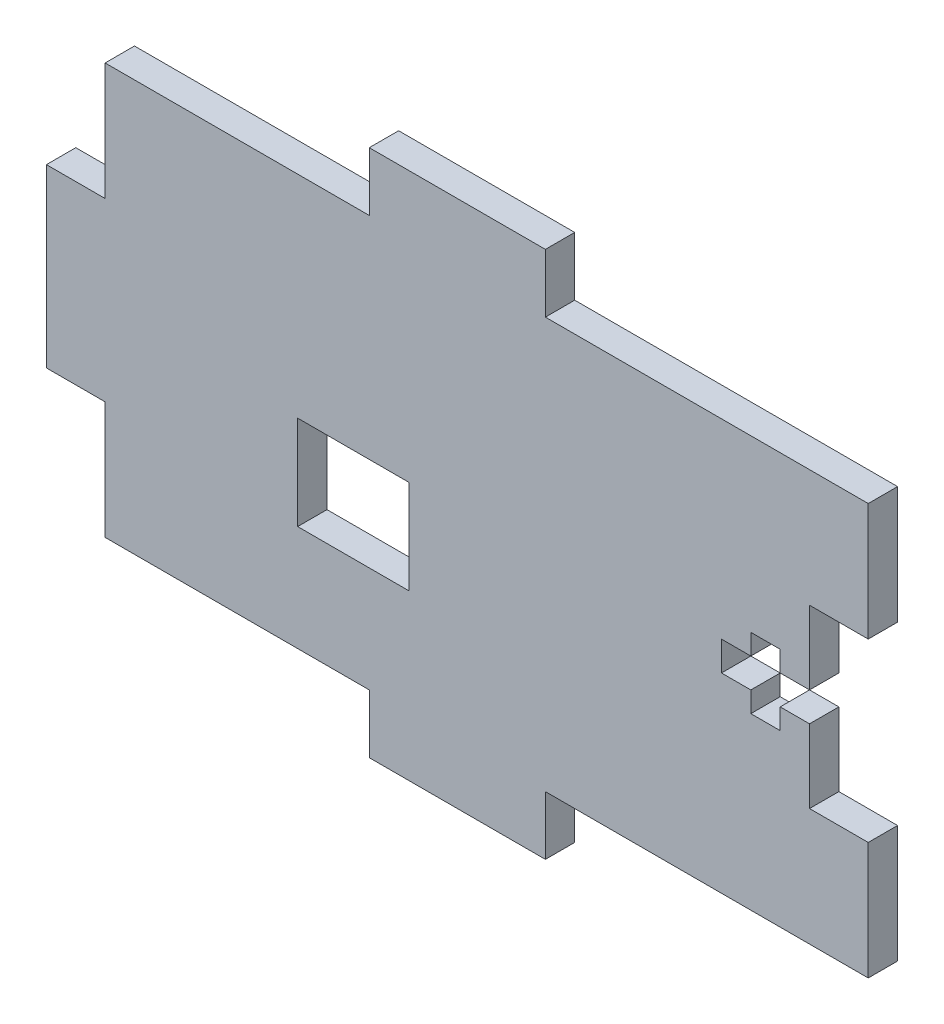
ISO-10303-21;
HEADER;
FILE_DESCRIPTION(('STEP AP214'),'2;1');
FILE_NAME('part.step','',(''),(''),'','','');
FILE_SCHEMA(('AUTOMOTIVE_DESIGN { 1 0 10303 214 1 1 1 1 }'));
ENDSEC;
DATA;
#1=APPLICATION_CONTEXT('core data for automotive mechanical design processes');
#2=APPLICATION_PROTOCOL_DEFINITION('international standard','automotive_design',2000,#1);
#3=PRODUCT_CONTEXT('',#1,'mechanical');
#4=PRODUCT('Part','Part','',(#3));
#5=PRODUCT_RELATED_PRODUCT_CATEGORY('part','',(#4));
#6=PRODUCT_DEFINITION_FORMATION('','',#4);
#7=PRODUCT_DEFINITION_CONTEXT('part definition',#1,'design');
#8=PRODUCT_DEFINITION('design','',#6,#7);
#9=PRODUCT_DEFINITION_SHAPE('','',#8);
#10=(LENGTH_UNIT() NAMED_UNIT(*) SI_UNIT(.MILLI.,.METRE.));
#11=(NAMED_UNIT(*) PLANE_ANGLE_UNIT() SI_UNIT($,.RADIAN.));
#12=(NAMED_UNIT(*) SI_UNIT($,.STERADIAN.) SOLID_ANGLE_UNIT());
#13=UNCERTAINTY_MEASURE_WITH_UNIT(LENGTH_MEASURE(1.E-05),#10,'distance_accuracy_value','');
#14=(GEOMETRIC_REPRESENTATION_CONTEXT(3) GLOBAL_UNCERTAINTY_ASSIGNED_CONTEXT((#13)) GLOBAL_UNIT_ASSIGNED_CONTEXT((#10,
#11,#12)) REPRESENTATION_CONTEXT('',''));
#15=CARTESIAN_POINT('',(0.,0.,0.));
#16=DIRECTION('',(0.,0.,1.));
#17=DIRECTION('',(1.,0.,0.));
#18=AXIS2_PLACEMENT_3D('',#15,#16,#17);
#19=CARTESIAN_POINT('',(76.2,12.7,0.));
#20=DIRECTION('',(-1.,0.,0.));
#21=DIRECTION('',(0.,0.,1.));
#22=AXIS2_PLACEMENT_3D('',#19,#20,#21);
#23=PLANE('',#22);
#24=DIRECTION('',(0.,-1.,0.));
#25=VECTOR('',#24,1.);
#26=CARTESIAN_POINT('',(76.2,12.7,3.175));
#27=LINE('',#26,#25);
#28=CARTESIAN_POINT('',(76.2,31.75,3.175));
#29=VERTEX_POINT('',#28);
#30=CARTESIAN_POINT('',(76.2,23.8125,3.175));
#31=VERTEX_POINT('',#30);
#32=EDGE_CURVE('E367',#29,#31,#27,.T.);
#33=ORIENTED_EDGE('',*,*,#32,.T.);
#34=DIRECTION('',(0.,0.,-1.));
#35=VECTOR('',#34,1.);
#36=CARTESIAN_POINT('',(76.2,23.8125,0.));
#37=LINE('',#36,#35);
#38=CARTESIAN_POINT('',(76.2,23.8125,0.));
#39=VERTEX_POINT('',#38);
#40=EDGE_CURVE('E421',#31,#39,#37,.T.);
#41=ORIENTED_EDGE('',*,*,#40,.T.);
#42=DIRECTION('',(0.,-1.,0.));
#43=VECTOR('',#42,1.);
#44=CARTESIAN_POINT('',(76.2,12.7,0.));
#45=LINE('',#44,#43);
#46=CARTESIAN_POINT('',(76.2,31.75,0.));
#47=VERTEX_POINT('',#46);
#48=EDGE_CURVE('E358',#47,#39,#45,.T.);
#49=ORIENTED_EDGE('',*,*,#48,.F.);
#50=DIRECTION('',(0.,0.,1.));
#51=VECTOR('',#50,1.);
#52=CARTESIAN_POINT('',(76.2,31.75,0.));
#53=LINE('',#52,#51);
#54=EDGE_CURVE('E378',#47,#29,#53,.T.);
#55=ORIENTED_EDGE('',*,*,#54,.T.);
#56=EDGE_LOOP('',(#33,#41,#49,#55));
#57=FACE_BOUND('',#56,.T.);
#58=ADVANCED_FACE('F33',(#57),#23,.F.);
#59=CARTESIAN_POINT('',(82.55,0.,3.175));
#60=DIRECTION('',(-1.,0.,0.));
#61=DIRECTION('',(0.,0.,1.));
#62=AXIS2_PLACEMENT_3D('',#59,#60,#61);
#63=PLANE('',#62);
#64=DIRECTION('',(0.,1.,0.));
#65=VECTOR('',#64,1.);
#66=CARTESIAN_POINT('',(82.55,0.,0.));
#67=LINE('',#66,#65);
#68=CARTESIAN_POINT('',(82.55,0.,0.));
#69=VERTEX_POINT('',#68);
#70=CARTESIAN_POINT('',(82.55,12.7,0.));
#71=VERTEX_POINT('',#70);
#72=EDGE_CURVE('E527',#69,#71,#67,.T.);
#73=ORIENTED_EDGE('',*,*,#72,.T.);
#74=DIRECTION('',(0.,0.,1.));
#75=VECTOR('',#74,1.);
#76=CARTESIAN_POINT('',(82.55,12.7,0.));
#77=LINE('',#76,#75);
#78=CARTESIAN_POINT('',(82.55,12.7,3.175));
#79=VERTEX_POINT('',#78);
#80=EDGE_CURVE('E371',#71,#79,#77,.T.);
#81=ORIENTED_EDGE('',*,*,#80,.T.);
#82=DIRECTION('',(0.,1.,0.));
#83=VECTOR('',#82,1.);
#84=CARTESIAN_POINT('',(82.55,0.,3.175));
#85=LINE('',#84,#83);
#86=CARTESIAN_POINT('',(82.55,0.,3.175));
#87=VERTEX_POINT('',#86);
#88=EDGE_CURVE('E633',#87,#79,#85,.T.);
#89=ORIENTED_EDGE('',*,*,#88,.F.);
#90=DIRECTION('',(0.,0.,-1.));
#91=VECTOR('',#90,1.);
#92=CARTESIAN_POINT('',(82.55,0.,3.175));
#93=LINE('',#92,#91);
#94=EDGE_CURVE('E532',#87,#69,#93,.T.);
#95=ORIENTED_EDGE('',*,*,#94,.T.);
#96=EDGE_LOOP('',(#73,#81,#89,#95));
#97=FACE_BOUND('',#96,.T.);
#98=ADVANCED_FACE('F497',(#97),#63,.F.);
#99=CARTESIAN_POINT('',(0.,0.,3.175));
#100=DIRECTION('',(0.,1.,0.));
#101=DIRECTION('',(0.,0.,1.));
#102=AXIS2_PLACEMENT_3D('',#99,#100,#101);
#103=PLANE('',#102);
#104=DIRECTION('',(0.,0.,1.));
#105=VECTOR('',#104,1.);
#106=CARTESIAN_POINT('',(47.625,0.,0.));
#107=LINE('',#106,#105);
#108=CARTESIAN_POINT('',(47.625,0.,0.));
#109=VERTEX_POINT('',#108);
#110=CARTESIAN_POINT('',(47.625,0.,3.175));
#111=VERTEX_POINT('',#110);
#112=EDGE_CURVE('E395',#109,#111,#107,.T.);
#113=ORIENTED_EDGE('',*,*,#112,.F.);
#114=DIRECTION('',(1.,0.,0.));
#115=VECTOR('',#114,1.);
#116=CARTESIAN_POINT('',(0.,0.,0.));
#117=LINE('',#116,#115);
#118=EDGE_CURVE('E622',#109,#69,#117,.T.);
#119=ORIENTED_EDGE('',*,*,#118,.T.);
#120=ORIENTED_EDGE('',*,*,#94,.F.);
#121=DIRECTION('',(1.,0.,0.));
#122=VECTOR('',#121,1.);
#123=CARTESIAN_POINT('',(0.,0.,3.175));
#124=LINE('',#123,#122);
#125=EDGE_CURVE('E629',#111,#87,#124,.T.);
#126=ORIENTED_EDGE('',*,*,#125,.F.);
#127=EDGE_LOOP('',(#113,#119,#120,#126));
#128=FACE_BOUND('',#127,.T.);
#129=ADVANCED_FACE('F503',(#128),#103,.F.);
#130=CARTESIAN_POINT('',(0.,44.45,3.175));
#131=DIRECTION('',(0.,-1.,0.));
#132=DIRECTION('',(0.,0.,-1.));
#133=AXIS2_PLACEMENT_3D('',#130,#131,#132);
#134=PLANE('',#133);
#135=DIRECTION('',(0.,0.,1.));
#136=VECTOR('',#135,1.);
#137=CARTESIAN_POINT('',(28.575,44.45,0.));
#138=LINE('',#137,#136);
#139=CARTESIAN_POINT('',(28.575,44.45,0.));
#140=VERTEX_POINT('',#139);
#141=CARTESIAN_POINT('',(28.575,44.45,3.175));
#142=VERTEX_POINT('',#141);
#143=EDGE_CURVE('E602',#140,#142,#138,.T.);
#144=ORIENTED_EDGE('',*,*,#143,.F.);
#145=DIRECTION('',(-1.,0.,0.));
#146=VECTOR('',#145,1.);
#147=CARTESIAN_POINT('',(0.,44.45,0.));
#148=LINE('',#147,#146);
#149=CARTESIAN_POINT('',(0.,44.45,0.));
#150=VERTEX_POINT('',#149);
#151=EDGE_CURVE('E533',#140,#150,#148,.T.);
#152=ORIENTED_EDGE('',*,*,#151,.T.);
#153=DIRECTION('',(0.,0.,-1.));
#154=VECTOR('',#153,1.);
#155=CARTESIAN_POINT('',(0.,44.45,3.175));
#156=LINE('',#155,#154);
#157=CARTESIAN_POINT('',(0.,44.45,3.175));
#158=VERTEX_POINT('',#157);
#159=EDGE_CURVE('E545',#158,#150,#156,.T.);
#160=ORIENTED_EDGE('',*,*,#159,.F.);
#161=DIRECTION('',(-1.,0.,0.));
#162=VECTOR('',#161,1.);
#163=CARTESIAN_POINT('',(0.,44.45,3.175));
#164=LINE('',#163,#162);
#165=EDGE_CURVE('E636',#142,#158,#164,.T.);
#166=ORIENTED_EDGE('',*,*,#165,.F.);
#167=EDGE_LOOP('',(#144,#152,#160,#166));
#168=FACE_BOUND('',#167,.T.);
#169=ADVANCED_FACE('F658',(#168),#134,.F.);
#170=CARTESIAN_POINT('',(0.,0.,3.175));
#171=DIRECTION('',(1.,0.,0.));
#172=DIRECTION('',(0.,1.,0.));
#173=AXIS2_PLACEMENT_3D('',#170,#171,#172);
#174=PLANE('',#173);
#175=DIRECTION('',(0.,0.,1.));
#176=VECTOR('',#175,1.);
#177=CARTESIAN_POINT('',(0.,12.7,0.));
#178=LINE('',#177,#176);
#179=CARTESIAN_POINT('',(0.,12.7,0.));
#180=VERTEX_POINT('',#179);
#181=CARTESIAN_POINT('',(0.,12.7,3.175));
#182=VERTEX_POINT('',#181);
#183=EDGE_CURVE('E566',#180,#182,#178,.T.);
#184=ORIENTED_EDGE('',*,*,#183,.F.);
#185=DIRECTION('',(0.,-1.,0.));
#186=VECTOR('',#185,1.);
#187=CARTESIAN_POINT('',(0.,0.,0.));
#188=LINE('',#187,#186);
#189=CARTESIAN_POINT('',(0.,0.,0.));
#190=VERTEX_POINT('',#189);
#191=EDGE_CURVE('E569',#180,#190,#188,.T.);
#192=ORIENTED_EDGE('',*,*,#191,.T.);
#193=DIRECTION('',(0.,0.,-1.));
#194=VECTOR('',#193,1.);
#195=CARTESIAN_POINT('',(0.,0.,3.175));
#196=LINE('',#195,#194);
#197=CARTESIAN_POINT('',(0.,0.,3.175));
#198=VERTEX_POINT('',#197);
#199=EDGE_CURVE('E412',#198,#190,#196,.T.);
#200=ORIENTED_EDGE('',*,*,#199,.F.);
#201=DIRECTION('',(0.,-1.,0.));
#202=VECTOR('',#201,1.);
#203=CARTESIAN_POINT('',(0.,0.,3.175));
#204=LINE('',#203,#202);
#205=EDGE_CURVE('E552',#182,#198,#204,.T.);
#206=ORIENTED_EDGE('',*,*,#205,.F.);
#207=EDGE_LOOP('',(#184,#192,#200,#206));
#208=FACE_BOUND('',#207,.T.);
#209=ADVANCED_FACE('F702',(#208),#174,.F.);
#210=CARTESIAN_POINT('',(0.,31.75,0.));
#211=VERTEX_POINT('',#210);
#212=EDGE_CURVE('E624',#150,#211,#188,.T.);
#213=ORIENTED_EDGE('',*,*,#212,.T.);
#214=DIRECTION('',(0.,0.,1.));
#215=VECTOR('',#214,1.);
#216=CARTESIAN_POINT('',(0.,31.75,0.));
#217=LINE('',#216,#215);
#218=CARTESIAN_POINT('',(0.,31.75,3.175));
#219=VERTEX_POINT('',#218);
#220=EDGE_CURVE('E564',#211,#219,#217,.T.);
#221=ORIENTED_EDGE('',*,*,#220,.T.);
#222=EDGE_CURVE('E653',#158,#219,#204,.T.);
#223=ORIENTED_EDGE('',*,*,#222,.F.);
#224=ORIENTED_EDGE('',*,*,#159,.T.);
#225=EDGE_LOOP('',(#213,#221,#223,#224));
#226=FACE_BOUND('',#225,.T.);
#227=ADVANCED_FACE('F35',(#226),#174,.F.);
#228=CARTESIAN_POINT('',(28.575,0.,0.));
#229=VERTEX_POINT('',#228);
#230=EDGE_CURVE('E538',#190,#229,#117,.T.);
#231=ORIENTED_EDGE('',*,*,#230,.T.);
#232=DIRECTION('',(0.,0.,1.));
#233=VECTOR('',#232,1.);
#234=CARTESIAN_POINT('',(28.575,0.,0.));
#235=LINE('',#234,#233);
#236=CARTESIAN_POINT('',(28.575,0.,3.175));
#237=VERTEX_POINT('',#236);
#238=EDGE_CURVE('E402',#229,#237,#235,.T.);
#239=ORIENTED_EDGE('',*,*,#238,.T.);
#240=EDGE_CURVE('E625',#198,#237,#124,.T.);
#241=ORIENTED_EDGE('',*,*,#240,.F.);
#242=ORIENTED_EDGE('',*,*,#199,.T.);
#243=EDGE_LOOP('',(#231,#239,#241,#242));
#244=FACE_BOUND('',#243,.T.);
#245=ADVANCED_FACE('F694',(#244),#103,.F.);
#246=CARTESIAN_POINT('',(82.55,31.75,3.175));
#247=VERTEX_POINT('',#246);
#248=CARTESIAN_POINT('',(82.55,44.45,3.175));
#249=VERTEX_POINT('',#248);
#250=EDGE_CURVE('E628',#247,#249,#85,.T.);
#251=ORIENTED_EDGE('',*,*,#250,.F.);
#252=DIRECTION('',(0.,0.,1.));
#253=VECTOR('',#252,1.);
#254=CARTESIAN_POINT('',(82.55,31.75,0.));
#255=LINE('',#254,#253);
#256=CARTESIAN_POINT('',(82.55,31.75,0.));
#257=VERTEX_POINT('',#256);
#258=EDGE_CURVE('E364',#257,#247,#255,.T.);
#259=ORIENTED_EDGE('',*,*,#258,.F.);
#260=CARTESIAN_POINT('',(82.55,44.45,0.));
#261=VERTEX_POINT('',#260);
#262=EDGE_CURVE('E534',#257,#261,#67,.T.);
#263=ORIENTED_EDGE('',*,*,#262,.T.);
#264=DIRECTION('',(0.,0.,-1.));
#265=VECTOR('',#264,1.);
#266=CARTESIAN_POINT('',(82.55,44.45,3.175));
#267=LINE('',#266,#265);
#268=EDGE_CURVE('E647',#249,#261,#267,.T.);
#269=ORIENTED_EDGE('',*,*,#268,.F.);
#270=EDGE_LOOP('',(#251,#259,#263,#269));
#271=FACE_BOUND('',#270,.T.);
#272=ADVANCED_FACE('F506',(#271),#63,.F.);
#273=CARTESIAN_POINT('',(47.625,44.45,0.));
#274=VERTEX_POINT('',#273);
#275=EDGE_CURVE('E536',#261,#274,#148,.T.);
#276=ORIENTED_EDGE('',*,*,#275,.T.);
#277=DIRECTION('',(0.,0.,1.));
#278=VECTOR('',#277,1.);
#279=CARTESIAN_POINT('',(47.625,44.45,0.));
#280=LINE('',#279,#278);
#281=CARTESIAN_POINT('',(47.625,44.45,3.175));
#282=VERTEX_POINT('',#281);
#283=EDGE_CURVE('E605',#274,#282,#280,.T.);
#284=ORIENTED_EDGE('',*,*,#283,.T.);
#285=EDGE_CURVE('E642',#249,#282,#164,.T.);
#286=ORIENTED_EDGE('',*,*,#285,.F.);
#287=ORIENTED_EDGE('',*,*,#268,.T.);
#288=EDGE_LOOP('',(#276,#284,#286,#287));
#289=FACE_BOUND('',#288,.T.);
#290=ADVANCED_FACE('F721',(#289),#134,.F.);
#291=CARTESIAN_POINT('',(0.,0.,3.175));
#292=DIRECTION('',(0.,0.,-1.));
#293=DIRECTION('',(-1.,0.,0.));
#294=AXIS2_PLACEMENT_3D('',#291,#292,#293);
#295=PLANE('',#294);
#296=DIRECTION('',(-1.,0.,0.));
#297=VECTOR('',#296,1.);
#298=CARTESIAN_POINT('',(20.828,21.59,3.175));
#299=LINE('',#298,#297);
#300=CARTESIAN_POINT('',(32.893,21.59,3.175));
#301=VERTEX_POINT('',#300);
#302=CARTESIAN_POINT('',(20.828,21.59,3.175));
#303=VERTEX_POINT('',#302);
#304=EDGE_CURVE('E335',#301,#303,#299,.T.);
#305=ORIENTED_EDGE('',*,*,#304,.F.);
#306=DIRECTION('',(0.,1.,0.));
#307=VECTOR('',#306,1.);
#308=CARTESIAN_POINT('',(32.893,11.43,3.175));
#309=LINE('',#308,#307);
#310=CARTESIAN_POINT('',(32.893,11.43,3.175));
#311=VERTEX_POINT('',#310);
#312=EDGE_CURVE('E56',#311,#301,#309,.T.);
#313=ORIENTED_EDGE('',*,*,#312,.F.);
#314=DIRECTION('',(1.,0.,0.));
#315=VECTOR('',#314,1.);
#316=CARTESIAN_POINT('',(20.828,11.43,3.175));
#317=LINE('',#316,#315);
#318=CARTESIAN_POINT('',(20.828,11.43,3.175));
#319=VERTEX_POINT('',#318);
#320=EDGE_CURVE('E341',#319,#311,#317,.T.);
#321=ORIENTED_EDGE('',*,*,#320,.F.);
#322=DIRECTION('',(0.,-1.,0.));
#323=VECTOR('',#322,1.);
#324=CARTESIAN_POINT('',(20.828,11.43,3.175));
#325=LINE('',#324,#323);
#326=EDGE_CURVE('E338',#303,#319,#325,.T.);
#327=ORIENTED_EDGE('',*,*,#326,.F.);
#328=EDGE_LOOP('',(#305,#313,#321,#327));
#329=FACE_BOUND('',#328,.T.);
#330=DIRECTION('',(0.,1.,0.));
#331=VECTOR('',#330,1.);
#332=CARTESIAN_POINT('',(73.025,26.035,3.175));
#333=LINE('',#332,#331);
#334=CARTESIAN_POINT('',(73.025,23.8125,3.175));
#335=VERTEX_POINT('',#334);
#336=CARTESIAN_POINT('',(73.025,26.035,3.175));
#337=VERTEX_POINT('',#336);
#338=EDGE_CURVE('E291',#335,#337,#333,.T.);
#339=ORIENTED_EDGE('',*,*,#338,.F.);
#340=DIRECTION('',(-1.,0.,0.));
#341=VECTOR('',#340,1.);
#342=CARTESIAN_POINT('',(76.2,23.8125,3.175));
#343=LINE('',#342,#341);
#344=EDGE_CURVE('E288',#31,#335,#343,.T.);
#345=ORIENTED_EDGE('',*,*,#344,.F.);
#346=ORIENTED_EDGE('',*,*,#32,.F.);
#347=DIRECTION('',(-1.,0.,0.));
#348=VECTOR('',#347,1.);
#349=CARTESIAN_POINT('',(82.55,31.75,3.175));
#350=LINE('',#349,#348);
#351=EDGE_CURVE('E347',#247,#29,#350,.T.);
#352=ORIENTED_EDGE('',*,*,#351,.F.);
#353=ORIENTED_EDGE('',*,*,#250,.T.);
#354=ORIENTED_EDGE('',*,*,#285,.T.);
#355=DIRECTION('',(0.,1.,0.));
#356=VECTOR('',#355,1.);
#357=CARTESIAN_POINT('',(47.625,44.45,3.175));
#358=LINE('',#357,#356);
#359=CARTESIAN_POINT('',(47.625,50.8,3.175));
#360=VERTEX_POINT('',#359);
#361=EDGE_CURVE('E617',#282,#360,#358,.T.);
#362=ORIENTED_EDGE('',*,*,#361,.T.);
#363=DIRECTION('',(-1.,0.,0.));
#364=VECTOR('',#363,1.);
#365=CARTESIAN_POINT('',(28.575,50.8,3.175));
#366=LINE('',#365,#364);
#367=CARTESIAN_POINT('',(28.575,50.8,3.175));
#368=VERTEX_POINT('',#367);
#369=EDGE_CURVE('E612',#360,#368,#366,.T.);
#370=ORIENTED_EDGE('',*,*,#369,.T.);
#371=DIRECTION('',(0.,-1.,0.));
#372=VECTOR('',#371,1.);
#373=CARTESIAN_POINT('',(28.575,44.45,3.175));
#374=LINE('',#373,#372);
#375=EDGE_CURVE('E398',#368,#142,#374,.T.);
#376=ORIENTED_EDGE('',*,*,#375,.T.);
#377=ORIENTED_EDGE('',*,*,#165,.T.);
#378=ORIENTED_EDGE('',*,*,#222,.T.);
#379=DIRECTION('',(-1.,0.,0.));
#380=VECTOR('',#379,1.);
#381=CARTESIAN_POINT('',(0.,31.75,3.175));
#382=LINE('',#381,#380);
#383=CARTESIAN_POINT('',(-6.35,31.75,3.175));
#384=VERTEX_POINT('',#383);
#385=EDGE_CURVE('E667',#219,#384,#382,.T.);
#386=ORIENTED_EDGE('',*,*,#385,.T.);
#387=DIRECTION('',(0.,-1.,0.));
#388=VECTOR('',#387,1.);
#389=CARTESIAN_POINT('',(-6.35,31.75,3.175));
#390=LINE('',#389,#388);
#391=CARTESIAN_POINT('',(-6.35,12.7,3.175));
#392=VERTEX_POINT('',#391);
#393=EDGE_CURVE('E559',#384,#392,#390,.T.);
#394=ORIENTED_EDGE('',*,*,#393,.T.);
#395=DIRECTION('',(1.,0.,0.));
#396=VECTOR('',#395,1.);
#397=CARTESIAN_POINT('',(0.,12.7,3.175));
#398=LINE('',#397,#396);
#399=EDGE_CURVE('E555',#392,#182,#398,.T.);
#400=ORIENTED_EDGE('',*,*,#399,.T.);
#401=ORIENTED_EDGE('',*,*,#205,.T.);
#402=ORIENTED_EDGE('',*,*,#240,.T.);
#403=DIRECTION('',(0.,-1.,0.));
#404=VECTOR('',#403,1.);
#405=CARTESIAN_POINT('',(28.575,0.,3.175));
#406=LINE('',#405,#404);
#407=CARTESIAN_POINT('',(28.575,-6.35,3.175));
#408=VERTEX_POINT('',#407);
#409=EDGE_CURVE('E374',#237,#408,#406,.T.);
#410=ORIENTED_EDGE('',*,*,#409,.T.);
#411=DIRECTION('',(1.,0.,0.));
#412=VECTOR('',#411,1.);
#413=CARTESIAN_POINT('',(28.575,-6.35,3.175));
#414=LINE('',#413,#412);
#415=CARTESIAN_POINT('',(47.625,-6.35,3.175));
#416=VERTEX_POINT('',#415);
#417=EDGE_CURVE('E386',#408,#416,#414,.T.);
#418=ORIENTED_EDGE('',*,*,#417,.T.);
#419=DIRECTION('',(0.,1.,0.));
#420=VECTOR('',#419,1.);
#421=CARTESIAN_POINT('',(47.625,0.,3.175));
#422=LINE('',#421,#420);
#423=EDGE_CURVE('E389',#416,#111,#422,.T.);
#424=ORIENTED_EDGE('',*,*,#423,.T.);
#425=ORIENTED_EDGE('',*,*,#125,.T.);
#426=ORIENTED_EDGE('',*,*,#88,.T.);
#427=DIRECTION('',(1.,0.,0.));
#428=VECTOR('',#427,1.);
#429=CARTESIAN_POINT('',(82.55,12.7,3.175));
#430=LINE('',#429,#428);
#431=CARTESIAN_POINT('',(76.2,12.7,3.175));
#432=VERTEX_POINT('',#431);
#433=EDGE_CURVE('E357',#432,#79,#430,.T.);
#434=ORIENTED_EDGE('',*,*,#433,.F.);
#435=CARTESIAN_POINT('',(76.2,20.6375,3.175));
#436=VERTEX_POINT('',#435);
#437=EDGE_CURVE('E287',#436,#432,#27,.T.);
#438=ORIENTED_EDGE('',*,*,#437,.F.);
#439=DIRECTION('',(1.,0.,0.));
#440=VECTOR('',#439,1.);
#441=CARTESIAN_POINT('',(76.2,20.6375,3.175));
#442=LINE('',#441,#440);
#443=CARTESIAN_POINT('',(73.025,20.6375,3.175));
#444=VERTEX_POINT('',#443);
#445=EDGE_CURVE('E48',#444,#436,#442,.T.);
#446=ORIENTED_EDGE('',*,*,#445,.F.);
#447=DIRECTION('',(0.,1.,0.));
#448=VECTOR('',#447,1.);
#449=CARTESIAN_POINT('',(73.025,20.6375,3.175));
#450=LINE('',#449,#448);
#451=CARTESIAN_POINT('',(73.025,18.415,3.175));
#452=VERTEX_POINT('',#451);
#453=EDGE_CURVE('E275',#452,#444,#450,.T.);
#454=ORIENTED_EDGE('',*,*,#453,.F.);
#455=DIRECTION('',(1.,0.,0.));
#456=VECTOR('',#455,1.);
#457=CARTESIAN_POINT('',(69.85,18.415,3.175));
#458=LINE('',#457,#456);
#459=CARTESIAN_POINT('',(69.85,18.415,3.175));
#460=VERTEX_POINT('',#459);
#461=EDGE_CURVE('E272',#460,#452,#458,.T.);
#462=ORIENTED_EDGE('',*,*,#461,.F.);
#463=DIRECTION('',(0.,-1.,0.));
#464=VECTOR('',#463,1.);
#465=CARTESIAN_POINT('',(69.85,20.6375,3.175));
#466=LINE('',#465,#464);
#467=CARTESIAN_POINT('',(69.85,20.6375,3.175));
#468=VERTEX_POINT('',#467);
#469=EDGE_CURVE('E311',#468,#460,#466,.T.);
#470=ORIENTED_EDGE('',*,*,#469,.F.);
#471=DIRECTION('',(1.,0.,0.));
#472=VECTOR('',#471,1.);
#473=CARTESIAN_POINT('',(69.85,20.6375,3.175));
#474=LINE('',#473,#472);
#475=CARTESIAN_POINT('',(66.675,20.6375,3.175));
#476=VERTEX_POINT('',#475);
#477=EDGE_CURVE('E308',#476,#468,#474,.T.);
#478=ORIENTED_EDGE('',*,*,#477,.F.);
#479=DIRECTION('',(0.,-1.,0.));
#480=VECTOR('',#479,1.);
#481=CARTESIAN_POINT('',(66.675,20.6375,3.175));
#482=LINE('',#481,#480);
#483=CARTESIAN_POINT('',(66.675,23.8125,3.175));
#484=VERTEX_POINT('',#483);
#485=EDGE_CURVE('E305',#484,#476,#482,.T.);
#486=ORIENTED_EDGE('',*,*,#485,.F.);
#487=DIRECTION('',(-1.,0.,0.));
#488=VECTOR('',#487,1.);
#489=CARTESIAN_POINT('',(69.85,23.8125,3.175));
#490=LINE('',#489,#488);
#491=CARTESIAN_POINT('',(69.85,23.8125,3.175));
#492=VERTEX_POINT('',#491);
#493=EDGE_CURVE('E302',#492,#484,#490,.T.);
#494=ORIENTED_EDGE('',*,*,#493,.F.);
#495=DIRECTION('',(0.,-1.,0.));
#496=VECTOR('',#495,1.);
#497=CARTESIAN_POINT('',(69.85,26.035,3.175));
#498=LINE('',#497,#496);
#499=CARTESIAN_POINT('',(69.85,26.035,3.175));
#500=VERTEX_POINT('',#499);
#501=EDGE_CURVE('E299',#500,#492,#498,.T.);
#502=ORIENTED_EDGE('',*,*,#501,.F.);
#503=DIRECTION('',(-1.,0.,0.));
#504=VECTOR('',#503,1.);
#505=CARTESIAN_POINT('',(69.85,26.035,3.175));
#506=LINE('',#505,#504);
#507=EDGE_CURVE('E296',#337,#500,#506,.T.);
#508=ORIENTED_EDGE('',*,*,#507,.F.);
#509=EDGE_LOOP('',(#339,#345,#346,#352,#353,#354,#362,#370,#376,#377,#378,#386,#394,#400,#401,
#402,#410,#418,#424,#425,#426,#434,#438,#446,#454,#462,#470,#478,#486,#494,#502,#508));
#510=FACE_BOUND('',#509,.T.);
#511=ADVANCED_FACE('F285',(#329,#510),#295,.F.);
#512=CARTESIAN_POINT('',(0.,0.,0.));
#513=DIRECTION('',(0.,0.,-1.));
#514=DIRECTION('',(-1.,0.,0.));
#515=AXIS2_PLACEMENT_3D('',#512,#513,#514);
#516=PLANE('',#515);
#517=DIRECTION('',(1.,0.,0.));
#518=VECTOR('',#517,1.);
#519=CARTESIAN_POINT('',(0.,23.8125,0.));
#520=LINE('',#519,#518);
#521=CARTESIAN_POINT('',(73.025,23.8125,0.));
#522=VERTEX_POINT('',#521);
#523=EDGE_CURVE('E332',#522,#39,#520,.T.);
#524=ORIENTED_EDGE('',*,*,#523,.F.);
#525=DIRECTION('',(0.,-1.,0.));
#526=VECTOR('',#525,1.);
#527=CARTESIAN_POINT('',(73.025,0.,0.));
#528=LINE('',#527,#526);
#529=CARTESIAN_POINT('',(73.025,26.035,0.));
#530=VERTEX_POINT('',#529);
#531=EDGE_CURVE('E11',#530,#522,#528,.T.);
#532=ORIENTED_EDGE('',*,*,#531,.F.);
#533=DIRECTION('',(1.,0.,0.));
#534=VECTOR('',#533,1.);
#535=CARTESIAN_POINT('',(0.,26.0349999999999,0.));
#536=LINE('',#535,#534);
#537=CARTESIAN_POINT('',(69.85,26.035,0.));
#538=VERTEX_POINT('',#537);
#539=EDGE_CURVE('E41',#538,#530,#536,.T.);
#540=ORIENTED_EDGE('',*,*,#539,.F.);
#541=DIRECTION('',(0.,1.,0.));
#542=VECTOR('',#541,1.);
#543=CARTESIAN_POINT('',(69.85,0.,0.));
#544=LINE('',#543,#542);
#545=CARTESIAN_POINT('',(69.85,23.8125,0.));
#546=VERTEX_POINT('',#545);
#547=EDGE_CURVE('E436',#546,#538,#544,.T.);
#548=ORIENTED_EDGE('',*,*,#547,.F.);
#549=DIRECTION('',(1.,0.,0.));
#550=VECTOR('',#549,1.);
#551=CARTESIAN_POINT('',(0.,23.8124999999999,0.));
#552=LINE('',#551,#550);
#553=CARTESIAN_POINT('',(66.675,23.8125,0.));
#554=VERTEX_POINT('',#553);
#555=EDGE_CURVE('E434',#554,#546,#552,.T.);
#556=ORIENTED_EDGE('',*,*,#555,.F.);
#557=DIRECTION('',(0.,1.,0.));
#558=VECTOR('',#557,1.);
#559=CARTESIAN_POINT('',(66.675,0.,0.));
#560=LINE('',#559,#558);
#561=CARTESIAN_POINT('',(66.675,20.6375,0.));
#562=VERTEX_POINT('',#561);
#563=EDGE_CURVE('E432',#562,#554,#560,.T.);
#564=ORIENTED_EDGE('',*,*,#563,.F.);
#565=DIRECTION('',(-1.,0.,0.));
#566=VECTOR('',#565,1.);
#567=CARTESIAN_POINT('',(0.,20.6374999999999,0.));
#568=LINE('',#567,#566);
#569=CARTESIAN_POINT('',(69.85,20.6375,0.));
#570=VERTEX_POINT('',#569);
#571=EDGE_CURVE('E430',#570,#562,#568,.T.);
#572=ORIENTED_EDGE('',*,*,#571,.F.);
#573=DIRECTION('',(0.,1.,0.));
#574=VECTOR('',#573,1.);
#575=CARTESIAN_POINT('',(69.85,0.,0.));
#576=LINE('',#575,#574);
#577=CARTESIAN_POINT('',(69.85,18.415,0.));
#578=VERTEX_POINT('',#577);
#579=EDGE_CURVE('E428',#578,#570,#576,.T.);
#580=ORIENTED_EDGE('',*,*,#579,.F.);
#581=DIRECTION('',(-1.,0.,0.));
#582=VECTOR('',#581,1.);
#583=CARTESIAN_POINT('',(0.,18.415,0.));
#584=LINE('',#583,#582);
#585=CARTESIAN_POINT('',(73.025,18.415,0.));
#586=VERTEX_POINT('',#585);
#587=EDGE_CURVE('E426',#586,#578,#584,.T.);
#588=ORIENTED_EDGE('',*,*,#587,.F.);
#589=DIRECTION('',(0.,-1.,0.));
#590=VECTOR('',#589,1.);
#591=CARTESIAN_POINT('',(73.025,0.,0.));
#592=LINE('',#591,#590);
#593=CARTESIAN_POINT('',(73.025,20.6375,0.));
#594=VERTEX_POINT('',#593);
#595=EDGE_CURVE('E424',#594,#586,#592,.T.);
#596=ORIENTED_EDGE('',*,*,#595,.F.);
#597=DIRECTION('',(-1.,0.,0.));
#598=VECTOR('',#597,1.);
#599=CARTESIAN_POINT('',(0.,20.6375,0.));
#600=LINE('',#599,#598);
#601=CARTESIAN_POINT('',(76.2,20.6375,0.));
#602=VERTEX_POINT('',#601);
#603=EDGE_CURVE('E268',#602,#594,#600,.T.);
#604=ORIENTED_EDGE('',*,*,#603,.F.);
#605=CARTESIAN_POINT('',(76.2,12.7,0.));
#606=VERTEX_POINT('',#605);
#607=EDGE_CURVE('E356',#602,#606,#45,.T.);
#608=ORIENTED_EDGE('',*,*,#607,.T.);
#609=DIRECTION('',(1.,0.,0.));
#610=VECTOR('',#609,1.);
#611=CARTESIAN_POINT('',(82.55,12.7,0.));
#612=LINE('',#611,#610);
#613=EDGE_CURVE('E361',#606,#71,#612,.T.);
#614=ORIENTED_EDGE('',*,*,#613,.T.);
#615=ORIENTED_EDGE('',*,*,#72,.F.);
#616=ORIENTED_EDGE('',*,*,#118,.F.);
#617=DIRECTION('',(0.,1.,0.));
#618=VECTOR('',#617,1.);
#619=CARTESIAN_POINT('',(47.625,0.,0.));
#620=LINE('',#619,#618);
#621=CARTESIAN_POINT('',(47.625,-6.35,0.));
#622=VERTEX_POINT('',#621);
#623=EDGE_CURVE('E384',#622,#109,#620,.T.);
#624=ORIENTED_EDGE('',*,*,#623,.F.);
#625=DIRECTION('',(1.,0.,0.));
#626=VECTOR('',#625,1.);
#627=CARTESIAN_POINT('',(28.575,-6.35,0.));
#628=LINE('',#627,#626);
#629=CARTESIAN_POINT('',(28.575,-6.35,0.));
#630=VERTEX_POINT('',#629);
#631=EDGE_CURVE('E381',#630,#622,#628,.T.);
#632=ORIENTED_EDGE('',*,*,#631,.F.);
#633=DIRECTION('',(0.,-1.,0.));
#634=VECTOR('',#633,1.);
#635=CARTESIAN_POINT('',(28.575,0.,0.));
#636=LINE('',#635,#634);
#637=EDGE_CURVE('E385',#229,#630,#636,.T.);
#638=ORIENTED_EDGE('',*,*,#637,.F.);
#639=ORIENTED_EDGE('',*,*,#230,.F.);
#640=ORIENTED_EDGE('',*,*,#191,.F.);
#641=DIRECTION('',(1.,0.,0.));
#642=VECTOR('',#641,1.);
#643=CARTESIAN_POINT('',(0.,12.7,0.));
#644=LINE('',#643,#642);
#645=CARTESIAN_POINT('',(-6.35,12.7,0.));
#646=VERTEX_POINT('',#645);
#647=EDGE_CURVE('E562',#646,#180,#644,.T.);
#648=ORIENTED_EDGE('',*,*,#647,.F.);
#649=DIRECTION('',(0.,-1.,0.));
#650=VECTOR('',#649,1.);
#651=CARTESIAN_POINT('',(-6.35,31.75,0.));
#652=LINE('',#651,#650);
#653=CARTESIAN_POINT('',(-6.35,31.75,0.));
#654=VERTEX_POINT('',#653);
#655=EDGE_CURVE('E565',#654,#646,#652,.T.);
#656=ORIENTED_EDGE('',*,*,#655,.F.);
#657=DIRECTION('',(-1.,0.,0.));
#658=VECTOR('',#657,1.);
#659=CARTESIAN_POINT('',(0.,31.75,0.));
#660=LINE('',#659,#658);
#661=EDGE_CURVE('E558',#211,#654,#660,.T.);
#662=ORIENTED_EDGE('',*,*,#661,.F.);
#663=ORIENTED_EDGE('',*,*,#212,.F.);
#664=ORIENTED_EDGE('',*,*,#151,.F.);
#665=DIRECTION('',(0.,-1.,0.));
#666=VECTOR('',#665,1.);
#667=CARTESIAN_POINT('',(28.575,44.45,0.));
#668=LINE('',#667,#666);
#669=CARTESIAN_POINT('',(28.575,50.8,0.));
#670=VERTEX_POINT('',#669);
#671=EDGE_CURVE('E609',#670,#140,#668,.T.);
#672=ORIENTED_EDGE('',*,*,#671,.F.);
#673=DIRECTION('',(-1.,0.,0.));
#674=VECTOR('',#673,1.);
#675=CARTESIAN_POINT('',(28.575,50.8,0.));
#676=LINE('',#675,#674);
#677=CARTESIAN_POINT('',(47.625,50.8,0.));
#678=VERTEX_POINT('',#677);
#679=EDGE_CURVE('E606',#678,#670,#676,.T.);
#680=ORIENTED_EDGE('',*,*,#679,.F.);
#681=DIRECTION('',(0.,1.,0.));
#682=VECTOR('',#681,1.);
#683=CARTESIAN_POINT('',(47.625,44.45,0.));
#684=LINE('',#683,#682);
#685=EDGE_CURVE('E611',#274,#678,#684,.T.);
#686=ORIENTED_EDGE('',*,*,#685,.F.);
#687=ORIENTED_EDGE('',*,*,#275,.F.);
#688=ORIENTED_EDGE('',*,*,#262,.F.);
#689=DIRECTION('',(-1.,0.,0.));
#690=VECTOR('',#689,1.);
#691=CARTESIAN_POINT('',(82.55,31.75,0.));
#692=LINE('',#691,#690);
#693=EDGE_CURVE('E353',#257,#47,#692,.T.);
#694=ORIENTED_EDGE('',*,*,#693,.T.);
#695=ORIENTED_EDGE('',*,*,#48,.T.);
#696=EDGE_LOOP('',(#524,#532,#540,#548,#556,#564,#572,#580,#588,#596,#604,#608,#614,#615,#616,
#624,#632,#638,#639,#640,#648,#656,#662,#663,#664,#672,#680,#686,#687,#688,#694,#695));
#697=FACE_BOUND('',#696,.T.);
#698=DIRECTION('',(0.,-1.,0.));
#699=VECTOR('',#698,1.);
#700=CARTESIAN_POINT('',(32.893,0.,0.));
#701=LINE('',#700,#699);
#702=CARTESIAN_POINT('',(32.893,21.59,0.));
#703=VERTEX_POINT('',#702);
#704=CARTESIAN_POINT('',(32.893,11.43,0.));
#705=VERTEX_POINT('',#704);
#706=EDGE_CURVE('E417',#703,#705,#701,.T.);
#707=ORIENTED_EDGE('',*,*,#706,.F.);
#708=DIRECTION('',(1.,0.,0.));
#709=VECTOR('',#708,1.);
#710=CARTESIAN_POINT('',(0.,21.59,0.));
#711=LINE('',#710,#709);
#712=CARTESIAN_POINT('',(20.828,21.59,0.));
#713=VERTEX_POINT('',#712);
#714=EDGE_CURVE('E409',#713,#703,#711,.T.);
#715=ORIENTED_EDGE('',*,*,#714,.F.);
#716=DIRECTION('',(0.,1.,0.));
#717=VECTOR('',#716,1.);
#718=CARTESIAN_POINT('',(20.828,0.,0.));
#719=LINE('',#718,#717);
#720=CARTESIAN_POINT('',(20.828,11.43,0.));
#721=VERTEX_POINT('',#720);
#722=EDGE_CURVE('E411',#721,#713,#719,.T.);
#723=ORIENTED_EDGE('',*,*,#722,.F.);
#724=DIRECTION('',(-1.,0.,0.));
#725=VECTOR('',#724,1.);
#726=CARTESIAN_POINT('',(0.,11.43,0.));
#727=LINE('',#726,#725);
#728=EDGE_CURVE('E415',#705,#721,#727,.T.);
#729=ORIENTED_EDGE('',*,*,#728,.F.);
#730=EDGE_LOOP('',(#707,#715,#723,#729));
#731=FACE_BOUND('',#730,.T.);
#732=ADVANCED_FACE('F450',(#697,#731),#516,.T.);
#733=CARTESIAN_POINT('',(0.,12.7,0.));
#734=DIRECTION('',(0.,-1.,0.));
#735=DIRECTION('',(0.,0.,-1.));
#736=AXIS2_PLACEMENT_3D('',#733,#734,#735);
#737=PLANE('',#736);
#738=ORIENTED_EDGE('',*,*,#399,.F.);
#739=DIRECTION('',(0.,0.,1.));
#740=VECTOR('',#739,1.);
#741=CARTESIAN_POINT('',(-6.35,12.7,0.));
#742=LINE('',#741,#740);
#743=EDGE_CURVE('E570',#646,#392,#742,.T.);
#744=ORIENTED_EDGE('',*,*,#743,.F.);
#745=ORIENTED_EDGE('',*,*,#647,.T.);
#746=ORIENTED_EDGE('',*,*,#183,.T.);
#747=EDGE_LOOP('',(#738,#744,#745,#746));
#748=FACE_BOUND('',#747,.T.);
#749=ADVANCED_FACE('F705',(#748),#737,.T.);
#750=CARTESIAN_POINT('',(-6.35,31.75,0.));
#751=DIRECTION('',(-1.,0.,0.));
#752=DIRECTION('',(0.,-1.,0.));
#753=AXIS2_PLACEMENT_3D('',#750,#751,#752);
#754=PLANE('',#753);
#755=ORIENTED_EDGE('',*,*,#393,.F.);
#756=DIRECTION('',(0.,0.,1.));
#757=VECTOR('',#756,1.);
#758=CARTESIAN_POINT('',(-6.35,31.75,0.));
#759=LINE('',#758,#757);
#760=EDGE_CURVE('E578',#654,#384,#759,.T.);
#761=ORIENTED_EDGE('',*,*,#760,.F.);
#762=ORIENTED_EDGE('',*,*,#655,.T.);
#763=ORIENTED_EDGE('',*,*,#743,.T.);
#764=EDGE_LOOP('',(#755,#761,#762,#763));
#765=FACE_BOUND('',#764,.T.);
#766=ADVANCED_FACE('F707',(#765),#754,.T.);
#767=CARTESIAN_POINT('',(0.,31.75,0.));
#768=DIRECTION('',(0.,1.,0.));
#769=DIRECTION('',(0.,0.,1.));
#770=AXIS2_PLACEMENT_3D('',#767,#768,#769);
#771=PLANE('',#770);
#772=ORIENTED_EDGE('',*,*,#385,.F.);
#773=ORIENTED_EDGE('',*,*,#220,.F.);
#774=ORIENTED_EDGE('',*,*,#661,.T.);
#775=ORIENTED_EDGE('',*,*,#760,.T.);
#776=EDGE_LOOP('',(#772,#773,#774,#775));
#777=FACE_BOUND('',#776,.T.);
#778=ADVANCED_FACE('F768',(#777),#771,.T.);
#779=CARTESIAN_POINT('',(28.575,44.45,0.));
#780=DIRECTION('',(-1.,0.,0.));
#781=DIRECTION('',(0.,-1.,0.));
#782=AXIS2_PLACEMENT_3D('',#779,#780,#781);
#783=PLANE('',#782);
#784=ORIENTED_EDGE('',*,*,#375,.F.);
#785=DIRECTION('',(0.,0.,1.));
#786=VECTOR('',#785,1.);
#787=CARTESIAN_POINT('',(28.575,50.8,0.));
#788=LINE('',#787,#786);
#789=EDGE_CURVE('E668',#670,#368,#788,.T.);
#790=ORIENTED_EDGE('',*,*,#789,.F.);
#791=ORIENTED_EDGE('',*,*,#671,.T.);
#792=ORIENTED_EDGE('',*,*,#143,.T.);
#793=EDGE_LOOP('',(#784,#790,#791,#792));
#794=FACE_BOUND('',#793,.T.);
#795=ADVANCED_FACE('F762',(#794),#783,.T.);
#796=CARTESIAN_POINT('',(28.575,50.8,0.));
#797=DIRECTION('',(0.,1.,0.));
#798=DIRECTION('',(0.,0.,1.));
#799=AXIS2_PLACEMENT_3D('',#796,#797,#798);
#800=PLANE('',#799);
#801=ORIENTED_EDGE('',*,*,#369,.F.);
#802=DIRECTION('',(0.,0.,1.));
#803=VECTOR('',#802,1.);
#804=CARTESIAN_POINT('',(47.625,50.8,0.));
#805=LINE('',#804,#803);
#806=EDGE_CURVE('E670',#678,#360,#805,.T.);
#807=ORIENTED_EDGE('',*,*,#806,.F.);
#808=ORIENTED_EDGE('',*,*,#679,.T.);
#809=ORIENTED_EDGE('',*,*,#789,.T.);
#810=EDGE_LOOP('',(#801,#807,#808,#809));
#811=FACE_BOUND('',#810,.T.);
#812=ADVANCED_FACE('F767',(#811),#800,.T.);
#813=CARTESIAN_POINT('',(47.625,44.45,0.));
#814=DIRECTION('',(1.,0.,0.));
#815=DIRECTION('',(0.,1.,0.));
#816=AXIS2_PLACEMENT_3D('',#813,#814,#815);
#817=PLANE('',#816);
#818=ORIENTED_EDGE('',*,*,#361,.F.);
#819=ORIENTED_EDGE('',*,*,#283,.F.);
#820=ORIENTED_EDGE('',*,*,#685,.T.);
#821=ORIENTED_EDGE('',*,*,#806,.T.);
#822=EDGE_LOOP('',(#818,#819,#820,#821));
#823=FACE_BOUND('',#822,.T.);
#824=ADVANCED_FACE('F780',(#823),#817,.T.);
#825=CARTESIAN_POINT('',(47.625,0.,0.));
#826=DIRECTION('',(1.,0.,0.));
#827=DIRECTION('',(0.,1.,0.));
#828=AXIS2_PLACEMENT_3D('',#825,#826,#827);
#829=PLANE('',#828);
#830=ORIENTED_EDGE('',*,*,#423,.F.);
#831=DIRECTION('',(0.,0.,1.));
#832=VECTOR('',#831,1.);
#833=CARTESIAN_POINT('',(47.625,-6.35,0.));
#834=LINE('',#833,#832);
#835=EDGE_CURVE('E392',#622,#416,#834,.T.);
#836=ORIENTED_EDGE('',*,*,#835,.F.);
#837=ORIENTED_EDGE('',*,*,#623,.T.);
#838=ORIENTED_EDGE('',*,*,#112,.T.);
#839=EDGE_LOOP('',(#830,#836,#837,#838));
#840=FACE_BOUND('',#839,.T.);
#841=ADVANCED_FACE('F713',(#840),#829,.T.);
#842=CARTESIAN_POINT('',(28.575,-6.35,0.));
#843=DIRECTION('',(0.,-1.,0.));
#844=DIRECTION('',(0.,0.,-1.));
#845=AXIS2_PLACEMENT_3D('',#842,#843,#844);
#846=PLANE('',#845);
#847=ORIENTED_EDGE('',*,*,#417,.F.);
#848=DIRECTION('',(0.,0.,1.));
#849=VECTOR('',#848,1.);
#850=CARTESIAN_POINT('',(28.575,-6.35,0.));
#851=LINE('',#850,#849);
#852=EDGE_CURVE('E679',#630,#408,#851,.T.);
#853=ORIENTED_EDGE('',*,*,#852,.F.);
#854=ORIENTED_EDGE('',*,*,#631,.T.);
#855=ORIENTED_EDGE('',*,*,#835,.T.);
#856=EDGE_LOOP('',(#847,#853,#854,#855));
#857=FACE_BOUND('',#856,.T.);
#858=ADVANCED_FACE('F798',(#857),#846,.T.);
#859=CARTESIAN_POINT('',(28.575,0.,0.));
#860=DIRECTION('',(-1.,0.,0.));
#861=DIRECTION('',(0.,-1.,0.));
#862=AXIS2_PLACEMENT_3D('',#859,#860,#861);
#863=PLANE('',#862);
#864=ORIENTED_EDGE('',*,*,#409,.F.);
#865=ORIENTED_EDGE('',*,*,#238,.F.);
#866=ORIENTED_EDGE('',*,*,#637,.T.);
#867=ORIENTED_EDGE('',*,*,#852,.T.);
#868=EDGE_LOOP('',(#864,#865,#866,#867));
#869=FACE_BOUND('',#868,.T.);
#870=ADVANCED_FACE('F519',(#869),#863,.T.);
#871=CARTESIAN_POINT('',(82.55,12.7,0.));
#872=DIRECTION('',(0.,-1.,0.));
#873=DIRECTION('',(1.,0.,0.));
#874=AXIS2_PLACEMENT_3D('',#871,#872,#873);
#875=PLANE('',#874);
#876=ORIENTED_EDGE('',*,*,#433,.T.);
#877=ORIENTED_EDGE('',*,*,#80,.F.);
#878=ORIENTED_EDGE('',*,*,#613,.F.);
#879=DIRECTION('',(0.,0.,1.));
#880=VECTOR('',#879,1.);
#881=CARTESIAN_POINT('',(76.2,12.7,0.));
#882=LINE('',#881,#880);
#883=EDGE_CURVE('E375',#606,#432,#882,.T.);
#884=ORIENTED_EDGE('',*,*,#883,.T.);
#885=EDGE_LOOP('',(#876,#877,#878,#884));
#886=FACE_BOUND('',#885,.T.);
#887=ADVANCED_FACE('F511',(#886),#875,.F.);
#888=ORIENTED_EDGE('',*,*,#607,.F.);
#889=DIRECTION('',(0.,0.,1.));
#890=VECTOR('',#889,1.);
#891=CARTESIAN_POINT('',(76.2,20.6375,0.));
#892=LINE('',#891,#890);
#893=EDGE_CURVE('E419',#602,#436,#892,.T.);
#894=ORIENTED_EDGE('',*,*,#893,.T.);
#895=ORIENTED_EDGE('',*,*,#437,.T.);
#896=ORIENTED_EDGE('',*,*,#883,.F.);
#897=EDGE_LOOP('',(#888,#894,#895,#896));
#898=FACE_BOUND('',#897,.T.);
#899=ADVANCED_FACE('F499',(#898),#23,.F.);
#900=CARTESIAN_POINT('',(82.55,31.75,0.));
#901=DIRECTION('',(0.,1.,0.));
#902=DIRECTION('',(0.,0.,1.));
#903=AXIS2_PLACEMENT_3D('',#900,#901,#902);
#904=PLANE('',#903);
#905=ORIENTED_EDGE('',*,*,#351,.T.);
#906=ORIENTED_EDGE('',*,*,#54,.F.);
#907=ORIENTED_EDGE('',*,*,#693,.F.);
#908=ORIENTED_EDGE('',*,*,#258,.T.);
#909=EDGE_LOOP('',(#905,#906,#907,#908));
#910=FACE_BOUND('',#909,.T.);
#911=ADVANCED_FACE('F510',(#910),#904,.F.);
#912=CARTESIAN_POINT('',(32.893,11.43,-5.00000000001367E-05));
#913=DIRECTION('',(1.,0.,0.));
#914=DIRECTION('',(0.,0.,-1.));
#915=AXIS2_PLACEMENT_3D('',#912,#913,#914);
#916=PLANE('',#915);
#917=ORIENTED_EDGE('',*,*,#706,.T.);
#918=DIRECTION('',(0.,0.,1.));
#919=VECTOR('',#918,1.);
#920=CARTESIAN_POINT('',(32.893,11.43,-5.00000000001367E-05));
#921=LINE('',#920,#919);
#922=EDGE_CURVE('E345',#705,#311,#921,.T.);
#923=ORIENTED_EDGE('',*,*,#922,.T.);
#924=ORIENTED_EDGE('',*,*,#312,.T.);
#925=DIRECTION('',(0.,0.,1.));
#926=VECTOR('',#925,1.);
#927=CARTESIAN_POINT('',(32.893,21.59,-5.00000000001367E-05));
#928=LINE('',#927,#926);
#929=EDGE_CURVE('E344',#703,#301,#928,.T.);
#930=ORIENTED_EDGE('',*,*,#929,.F.);
#931=EDGE_LOOP('',(#917,#923,#924,#930));
#932=FACE_BOUND('',#931,.T.);
#933=ADVANCED_FACE('F517',(#932),#916,.F.);
#934=CARTESIAN_POINT('',(20.828,11.43,-5.00000000001367E-05));
#935=DIRECTION('',(0.,-1.,0.));
#936=DIRECTION('',(0.,0.,-1.));
#937=AXIS2_PLACEMENT_3D('',#934,#935,#936);
#938=PLANE('',#937);
#939=ORIENTED_EDGE('',*,*,#728,.T.);
#940=DIRECTION('',(0.,0.,1.));
#941=VECTOR('',#940,1.);
#942=CARTESIAN_POINT('',(20.828,11.43,-5.00000000001367E-05));
#943=LINE('',#942,#941);
#944=EDGE_CURVE('E348',#721,#319,#943,.T.);
#945=ORIENTED_EDGE('',*,*,#944,.T.);
#946=ORIENTED_EDGE('',*,*,#320,.T.);
#947=ORIENTED_EDGE('',*,*,#922,.F.);
#948=EDGE_LOOP('',(#939,#945,#946,#947));
#949=FACE_BOUND('',#948,.T.);
#950=ADVANCED_FACE('F847',(#949),#938,.F.);
#951=CARTESIAN_POINT('',(20.828,11.43,-5.00000000001367E-05));
#952=DIRECTION('',(-1.,0.,0.));
#953=DIRECTION('',(0.,0.,1.));
#954=AXIS2_PLACEMENT_3D('',#951,#952,#953);
#955=PLANE('',#954);
#956=ORIENTED_EDGE('',*,*,#722,.T.);
#957=DIRECTION('',(0.,0.,1.));
#958=VECTOR('',#957,1.);
#959=CARTESIAN_POINT('',(20.828,21.59,-5.00000000001367E-05));
#960=LINE('',#959,#958);
#961=EDGE_CURVE('E350',#713,#303,#960,.T.);
#962=ORIENTED_EDGE('',*,*,#961,.T.);
#963=ORIENTED_EDGE('',*,*,#326,.T.);
#964=ORIENTED_EDGE('',*,*,#944,.F.);
#965=EDGE_LOOP('',(#956,#962,#963,#964));
#966=FACE_BOUND('',#965,.T.);
#967=ADVANCED_FACE('F856',(#966),#955,.F.);
#968=CARTESIAN_POINT('',(20.828,21.59,-5.00000000001367E-05));
#969=DIRECTION('',(0.,1.,0.));
#970=DIRECTION('',(0.,0.,1.));
#971=AXIS2_PLACEMENT_3D('',#968,#969,#970);
#972=PLANE('',#971);
#973=ORIENTED_EDGE('',*,*,#714,.T.);
#974=ORIENTED_EDGE('',*,*,#929,.T.);
#975=ORIENTED_EDGE('',*,*,#304,.T.);
#976=ORIENTED_EDGE('',*,*,#961,.F.);
#977=EDGE_LOOP('',(#973,#974,#975,#976));
#978=FACE_BOUND('',#977,.T.);
#979=ADVANCED_FACE('F494',(#978),#972,.F.);
#980=CARTESIAN_POINT('',(73.025,20.6375,-5.00000000001367E-05));
#981=DIRECTION('',(1.,0.,0.));
#982=DIRECTION('',(0.,0.,-1.));
#983=AXIS2_PLACEMENT_3D('',#980,#981,#982);
#984=PLANE('',#983);
#985=ORIENTED_EDGE('',*,*,#595,.T.);
#986=DIRECTION('',(0.,0.,1.));
#987=VECTOR('',#986,1.);
#988=CARTESIAN_POINT('',(73.025,18.415,-5.00000000001367E-05));
#989=LINE('',#988,#987);
#990=EDGE_CURVE('E278',#586,#452,#989,.T.);
#991=ORIENTED_EDGE('',*,*,#990,.T.);
#992=ORIENTED_EDGE('',*,*,#453,.T.);
#993=DIRECTION('',(0.,0.,1.));
#994=VECTOR('',#993,1.);
#995=CARTESIAN_POINT('',(73.025,20.6375,-5.00000000001367E-05));
#996=LINE('',#995,#994);
#997=EDGE_CURVE('E264',#594,#444,#996,.T.);
#998=ORIENTED_EDGE('',*,*,#997,.F.);
#999=EDGE_LOOP('',(#985,#991,#992,#998));
#1000=FACE_BOUND('',#999,.T.);
#1001=ADVANCED_FACE('F276',(#1000),#984,.F.);
#1002=CARTESIAN_POINT('',(69.85,18.415,-5.00000000001367E-05));
#1003=DIRECTION('',(0.,-1.,0.));
#1004=DIRECTION('',(0.,0.,-1.));
#1005=AXIS2_PLACEMENT_3D('',#1002,#1003,#1004);
#1006=PLANE('',#1005);
#1007=ORIENTED_EDGE('',*,*,#587,.T.);
#1008=DIRECTION('',(0.,0.,1.));
#1009=VECTOR('',#1008,1.);
#1010=CARTESIAN_POINT('',(69.85,18.415,-5.00000000001367E-05));
#1011=LINE('',#1010,#1009);
#1012=EDGE_CURVE('E316',#578,#460,#1011,.T.);
#1013=ORIENTED_EDGE('',*,*,#1012,.T.);
#1014=ORIENTED_EDGE('',*,*,#461,.T.);
#1015=ORIENTED_EDGE('',*,*,#990,.F.);
#1016=EDGE_LOOP('',(#1007,#1013,#1014,#1015));
#1017=FACE_BOUND('',#1016,.T.);
#1018=ADVANCED_FACE('F486',(#1017),#1006,.F.);
#1019=CARTESIAN_POINT('',(69.85,20.6375,-5.00000000001367E-05));
#1020=DIRECTION('',(-1.,0.,0.));
#1021=DIRECTION('',(0.,0.,1.));
#1022=AXIS2_PLACEMENT_3D('',#1019,#1020,#1021);
#1023=PLANE('',#1022);
#1024=ORIENTED_EDGE('',*,*,#579,.T.);
#1025=DIRECTION('',(0.,0.,1.));
#1026=VECTOR('',#1025,1.);
#1027=CARTESIAN_POINT('',(69.85,20.6375,-5.00000000001367E-05));
#1028=LINE('',#1027,#1026);
#1029=EDGE_CURVE('E318',#570,#468,#1028,.T.);
#1030=ORIENTED_EDGE('',*,*,#1029,.T.);
#1031=ORIENTED_EDGE('',*,*,#469,.T.);
#1032=ORIENTED_EDGE('',*,*,#1012,.F.);
#1033=EDGE_LOOP('',(#1024,#1030,#1031,#1032));
#1034=FACE_BOUND('',#1033,.T.);
#1035=ADVANCED_FACE('F484',(#1034),#1023,.F.);
#1036=CARTESIAN_POINT('',(69.85,20.6375,-5.00000000001367E-05));
#1037=DIRECTION('',(0.,-1.,0.));
#1038=DIRECTION('',(1.,0.,0.));
#1039=AXIS2_PLACEMENT_3D('',#1036,#1037,#1038);
#1040=PLANE('',#1039);
#1041=ORIENTED_EDGE('',*,*,#571,.T.);
#1042=DIRECTION('',(0.,0.,1.));
#1043=VECTOR('',#1042,1.);
#1044=CARTESIAN_POINT('',(66.675,20.6375,-5.00000000001367E-05));
#1045=LINE('',#1044,#1043);
#1046=EDGE_CURVE('E320',#562,#476,#1045,.T.);
#1047=ORIENTED_EDGE('',*,*,#1046,.T.);
#1048=ORIENTED_EDGE('',*,*,#477,.T.);
#1049=ORIENTED_EDGE('',*,*,#1029,.F.);
#1050=EDGE_LOOP('',(#1041,#1047,#1048,#1049));
#1051=FACE_BOUND('',#1050,.T.);
#1052=ADVANCED_FACE('F477',(#1051),#1040,.F.);
#1053=CARTESIAN_POINT('',(66.675,20.6375,-5.00000000001367E-05));
#1054=DIRECTION('',(-1.,0.,0.));
#1055=DIRECTION('',(0.,0.,1.));
#1056=AXIS2_PLACEMENT_3D('',#1053,#1054,#1055);
#1057=PLANE('',#1056);
#1058=ORIENTED_EDGE('',*,*,#563,.T.);
#1059=DIRECTION('',(0.,0.,1.));
#1060=VECTOR('',#1059,1.);
#1061=CARTESIAN_POINT('',(66.675,23.8125,-5.00000000001367E-05));
#1062=LINE('',#1061,#1060);
#1063=EDGE_CURVE('E322',#554,#484,#1062,.T.);
#1064=ORIENTED_EDGE('',*,*,#1063,.T.);
#1065=ORIENTED_EDGE('',*,*,#485,.T.);
#1066=ORIENTED_EDGE('',*,*,#1046,.F.);
#1067=EDGE_LOOP('',(#1058,#1064,#1065,#1066));
#1068=FACE_BOUND('',#1067,.T.);
#1069=ADVANCED_FACE('F473',(#1068),#1057,.F.);
#1070=CARTESIAN_POINT('',(69.85,23.8125,-5.00000000001367E-05));
#1071=DIRECTION('',(0.,1.,0.));
#1072=DIRECTION('',(-1.,0.,0.));
#1073=AXIS2_PLACEMENT_3D('',#1070,#1071,#1072);
#1074=PLANE('',#1073);
#1075=ORIENTED_EDGE('',*,*,#555,.T.);
#1076=DIRECTION('',(0.,0.,1.));
#1077=VECTOR('',#1076,1.);
#1078=CARTESIAN_POINT('',(69.85,23.8125,-5.00000000001367E-05));
#1079=LINE('',#1078,#1077);
#1080=EDGE_CURVE('E324',#546,#492,#1079,.T.);
#1081=ORIENTED_EDGE('',*,*,#1080,.T.);
#1082=ORIENTED_EDGE('',*,*,#493,.T.);
#1083=ORIENTED_EDGE('',*,*,#1063,.F.);
#1084=EDGE_LOOP('',(#1075,#1081,#1082,#1083));
#1085=FACE_BOUND('',#1084,.T.);
#1086=ADVANCED_FACE('F471',(#1085),#1074,.F.);
#1087=CARTESIAN_POINT('',(69.85,26.035,-5.00000000001367E-05));
#1088=DIRECTION('',(-1.,0.,0.));
#1089=DIRECTION('',(0.,0.,1.));
#1090=AXIS2_PLACEMENT_3D('',#1087,#1088,#1089);
#1091=PLANE('',#1090);
#1092=ORIENTED_EDGE('',*,*,#547,.T.);
#1093=DIRECTION('',(0.,0.,1.));
#1094=VECTOR('',#1093,1.);
#1095=CARTESIAN_POINT('',(69.85,26.035,-5.00000000001367E-05));
#1096=LINE('',#1095,#1094);
#1097=EDGE_CURVE('E326',#538,#500,#1096,.T.);
#1098=ORIENTED_EDGE('',*,*,#1097,.T.);
#1099=ORIENTED_EDGE('',*,*,#501,.T.);
#1100=ORIENTED_EDGE('',*,*,#1080,.F.);
#1101=EDGE_LOOP('',(#1092,#1098,#1099,#1100));
#1102=FACE_BOUND('',#1101,.T.);
#1103=ADVANCED_FACE('F465',(#1102),#1091,.F.);
#1104=CARTESIAN_POINT('',(69.85,26.035,-5.00000000001367E-05));
#1105=DIRECTION('',(0.,1.,0.));
#1106=DIRECTION('',(-1.,0.,0.));
#1107=AXIS2_PLACEMENT_3D('',#1104,#1105,#1106);
#1108=PLANE('',#1107);
#1109=ORIENTED_EDGE('',*,*,#539,.T.);
#1110=DIRECTION('',(0.,0.,1.));
#1111=VECTOR('',#1110,1.);
#1112=CARTESIAN_POINT('',(73.025,26.035,-5.00000000001367E-05));
#1113=LINE('',#1112,#1111);
#1114=EDGE_CURVE('E328',#530,#337,#1113,.T.);
#1115=ORIENTED_EDGE('',*,*,#1114,.T.);
#1116=ORIENTED_EDGE('',*,*,#507,.T.);
#1117=ORIENTED_EDGE('',*,*,#1097,.F.);
#1118=EDGE_LOOP('',(#1109,#1115,#1116,#1117));
#1119=FACE_BOUND('',#1118,.T.);
#1120=ADVANCED_FACE('F441',(#1119),#1108,.F.);
#1121=CARTESIAN_POINT('',(73.025,26.035,-5.00000000001367E-05));
#1122=DIRECTION('',(1.,0.,0.));
#1123=DIRECTION('',(0.,0.,-1.));
#1124=AXIS2_PLACEMENT_3D('',#1121,#1122,#1123);
#1125=PLANE('',#1124);
#1126=ORIENTED_EDGE('',*,*,#531,.T.);
#1127=DIRECTION('',(0.,0.,1.));
#1128=VECTOR('',#1127,1.);
#1129=CARTESIAN_POINT('',(73.025,23.8125,-5.00000000001367E-05));
#1130=LINE('',#1129,#1128);
#1131=EDGE_CURVE('E271',#522,#335,#1130,.T.);
#1132=ORIENTED_EDGE('',*,*,#1131,.T.);
#1133=ORIENTED_EDGE('',*,*,#338,.T.);
#1134=ORIENTED_EDGE('',*,*,#1114,.F.);
#1135=EDGE_LOOP('',(#1126,#1132,#1133,#1134));
#1136=FACE_BOUND('',#1135,.T.);
#1137=ADVANCED_FACE('F446',(#1136),#1125,.F.);
#1138=CARTESIAN_POINT('',(76.2,23.8125,-5.00000000001367E-05));
#1139=DIRECTION('',(0.,1.,0.));
#1140=DIRECTION('',(0.,0.,1.));
#1141=AXIS2_PLACEMENT_3D('',#1138,#1139,#1140);
#1142=PLANE('',#1141);
#1143=ORIENTED_EDGE('',*,*,#523,.T.);
#1144=ORIENTED_EDGE('',*,*,#40,.F.);
#1145=ORIENTED_EDGE('',*,*,#344,.T.);
#1146=ORIENTED_EDGE('',*,*,#1131,.F.);
#1147=EDGE_LOOP('',(#1143,#1144,#1145,#1146));
#1148=FACE_BOUND('',#1147,.T.);
#1149=ADVANCED_FACE('F453',(#1148),#1142,.F.);
#1150=CARTESIAN_POINT('',(76.2,20.6375,-5.00000000001367E-05));
#1151=DIRECTION('',(0.,-1.,0.));
#1152=DIRECTION('',(0.,0.,-1.));
#1153=AXIS2_PLACEMENT_3D('',#1150,#1151,#1152);
#1154=PLANE('',#1153);
#1155=ORIENTED_EDGE('',*,*,#603,.T.);
#1156=ORIENTED_EDGE('',*,*,#997,.T.);
#1157=ORIENTED_EDGE('',*,*,#445,.T.);
#1158=ORIENTED_EDGE('',*,*,#893,.F.);
#1159=EDGE_LOOP('',(#1155,#1156,#1157,#1158));
#1160=FACE_BOUND('',#1159,.T.);
#1161=ADVANCED_FACE('F266',(#1160),#1154,.F.);
#1162=CLOSED_SHELL('',(#58,#98,#129,#169,#209,#227,#245,#272,#290,#511,#732,#749,#766,#778,#795,
#812,#824,#841,#858,#870,#887,#899,#911,#933,#950,#967,#979,#1001,#1018,#1035,#1052,#1069,#1086,
#1103,#1120,#1137,#1149,#1161));
#1163=MANIFOLD_SOLID_BREP('B2',#1162);
#1164=ADVANCED_BREP_SHAPE_REPRESENTATION('',(#18,#1163),#14);
#1165=SHAPE_DEFINITION_REPRESENTATION(#9,#1164);
ENDSEC;
END-ISO-10303-21;
